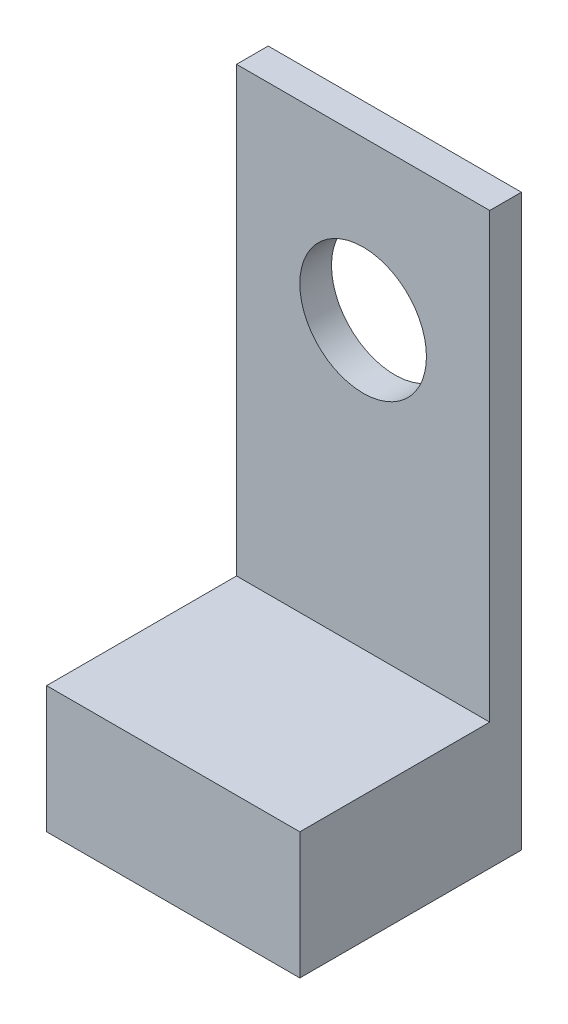
ISO-10303-21;
HEADER;
FILE_DESCRIPTION(('STEP AP214'),'2;1');
FILE_NAME('part.step','',(''),(''),'','','');
FILE_SCHEMA(('AUTOMOTIVE_DESIGN { 1 0 10303 214 1 1 1 1 }'));
ENDSEC;
DATA;
#1=APPLICATION_CONTEXT('core data for automotive mechanical design processes');
#2=APPLICATION_PROTOCOL_DEFINITION('international standard','automotive_design',2000,#1);
#3=PRODUCT_CONTEXT('',#1,'mechanical');
#4=PRODUCT('Part','Part','',(#3));
#5=PRODUCT_RELATED_PRODUCT_CATEGORY('part','',(#4));
#6=PRODUCT_DEFINITION_FORMATION('','',#4);
#7=PRODUCT_DEFINITION_CONTEXT('part definition',#1,'design');
#8=PRODUCT_DEFINITION('design','',#6,#7);
#9=PRODUCT_DEFINITION_SHAPE('','',#8);
#10=(LENGTH_UNIT() NAMED_UNIT(*) SI_UNIT(.MILLI.,.METRE.));
#11=(NAMED_UNIT(*) PLANE_ANGLE_UNIT() SI_UNIT($,.RADIAN.));
#12=(NAMED_UNIT(*) SI_UNIT($,.STERADIAN.) SOLID_ANGLE_UNIT());
#13=UNCERTAINTY_MEASURE_WITH_UNIT(LENGTH_MEASURE(1.E-05),#10,'distance_accuracy_value','');
#14=(GEOMETRIC_REPRESENTATION_CONTEXT(3) GLOBAL_UNCERTAINTY_ASSIGNED_CONTEXT((#13)) GLOBAL_UNIT_ASSIGNED_CONTEXT((#10,
#11,#12)) REPRESENTATION_CONTEXT('',''));
#15=CARTESIAN_POINT('',(0.,0.,0.));
#16=DIRECTION('',(0.,0.,1.));
#17=DIRECTION('',(1.,0.,0.));
#18=AXIS2_PLACEMENT_3D('',#15,#16,#17);
#19=CARTESIAN_POINT('',(19.8927253663827,59.603113743464,5.));
#20=DIRECTION('',(-1.,0.,0.));
#21=DIRECTION('',(0.,-1.,0.));
#22=AXIS2_PLACEMENT_3D('',#19,#20,#21);
#23=PLANE('',#22);
#24=DIRECTION('',(0.,1.,0.));
#25=VECTOR('',#24,1.);
#26=CARTESIAN_POINT('',(19.8927253663827,59.603113743464,0.));
#27=LINE('',#26,#25);
#28=CARTESIAN_POINT('',(19.8927253663827,-30.396886256536,0.));
#29=VERTEX_POINT('',#28);
#30=CARTESIAN_POINT('',(19.8927253663827,59.603113743464,0.));
#31=VERTEX_POINT('',#30);
#32=EDGE_CURVE('E95',#29,#31,#27,.T.);
#33=ORIENTED_EDGE('',*,*,#32,.T.);
#34=DIRECTION('',(0.,0.,-1.));
#35=VECTOR('',#34,1.);
#36=CARTESIAN_POINT('',(19.8927253663827,59.603113743464,5.));
#37=LINE('',#36,#35);
#38=CARTESIAN_POINT('',(19.8927253663827,59.603113743464,5.));
#39=VERTEX_POINT('',#38);
#40=EDGE_CURVE('E11',#39,#31,#37,.T.);
#41=ORIENTED_EDGE('',*,*,#40,.F.);
#42=DIRECTION('',(0.,1.,0.));
#43=VECTOR('',#42,1.);
#44=CARTESIAN_POINT('',(19.8927253663827,59.603113743464,5.));
#45=LINE('',#44,#43);
#46=CARTESIAN_POINT('',(19.8927253663827,-10.396886256536,5.));
#47=VERTEX_POINT('',#46);
#48=EDGE_CURVE('E88',#47,#39,#45,.T.);
#49=ORIENTED_EDGE('',*,*,#48,.F.);
#50=DIRECTION('',(0.,0.,-1.));
#51=VECTOR('',#50,1.);
#52=CARTESIAN_POINT('',(19.8927253663827,-10.396886256536,35.));
#53=LINE('',#52,#51);
#54=CARTESIAN_POINT('',(19.8927253663827,-10.396886256536,35.));
#55=VERTEX_POINT('',#54);
#56=EDGE_CURVE('E103',#55,#47,#53,.T.);
#57=ORIENTED_EDGE('',*,*,#56,.F.);
#58=DIRECTION('',(0.,1.,0.));
#59=VECTOR('',#58,1.);
#60=CARTESIAN_POINT('',(19.8927253663827,-30.396886256536,35.));
#61=LINE('',#60,#59);
#62=CARTESIAN_POINT('',(19.8927253663827,-30.396886256536,35.));
#63=VERTEX_POINT('',#62);
#64=EDGE_CURVE('E98',#63,#55,#61,.T.);
#65=ORIENTED_EDGE('',*,*,#64,.F.);
#66=DIRECTION('',(0.,0.,-1.));
#67=VECTOR('',#66,1.);
#68=CARTESIAN_POINT('',(19.8927253663827,-30.396886256536,5.));
#69=LINE('',#68,#67);
#70=EDGE_CURVE('E81',#63,#29,#69,.T.);
#71=ORIENTED_EDGE('',*,*,#70,.T.);
#72=EDGE_LOOP('',(#33,#41,#49,#57,#65,#71));
#73=FACE_BOUND('',#72,.T.);
#74=ADVANCED_FACE('F36',(#73),#23,.F.);
#75=CARTESIAN_POINT('',(-20.1072746336173,59.603113743464,5.));
#76=DIRECTION('',(0.,-1.,0.));
#77=DIRECTION('',(0.,0.,-1.));
#78=AXIS2_PLACEMENT_3D('',#75,#76,#77);
#79=PLANE('',#78);
#80=DIRECTION('',(-1.,0.,0.));
#81=VECTOR('',#80,1.);
#82=CARTESIAN_POINT('',(-20.1072746336173,59.603113743464,0.));
#83=LINE('',#82,#81);
#84=CARTESIAN_POINT('',(-20.1072746336173,59.603113743464,0.));
#85=VERTEX_POINT('',#84);
#86=EDGE_CURVE('E102',#31,#85,#83,.T.);
#87=ORIENTED_EDGE('',*,*,#86,.T.);
#88=DIRECTION('',(0.,0.,-1.));
#89=VECTOR('',#88,1.);
#90=CARTESIAN_POINT('',(-20.1072746336173,59.603113743464,5.));
#91=LINE('',#90,#89);
#92=CARTESIAN_POINT('',(-20.1072746336173,59.603113743464,5.));
#93=VERTEX_POINT('',#92);
#94=EDGE_CURVE('E43',#93,#85,#91,.T.);
#95=ORIENTED_EDGE('',*,*,#94,.F.);
#96=DIRECTION('',(-1.,0.,0.));
#97=VECTOR('',#96,1.);
#98=CARTESIAN_POINT('',(-20.1072746336173,59.603113743464,5.));
#99=LINE('',#98,#97);
#100=EDGE_CURVE('E56',#39,#93,#99,.T.);
#101=ORIENTED_EDGE('',*,*,#100,.F.);
#102=ORIENTED_EDGE('',*,*,#40,.T.);
#103=EDGE_LOOP('',(#87,#95,#101,#102));
#104=FACE_BOUND('',#103,.T.);
#105=ADVANCED_FACE('F119',(#104),#79,.F.);
#106=CARTESIAN_POINT('',(-20.1072746336173,59.603113743464,5.));
#107=DIRECTION('',(1.,0.,0.));
#108=DIRECTION('',(0.,1.,0.));
#109=AXIS2_PLACEMENT_3D('',#106,#107,#108);
#110=PLANE('',#109);
#111=DIRECTION('',(0.,-1.,0.));
#112=VECTOR('',#111,1.);
#113=CARTESIAN_POINT('',(-20.1072746336173,59.603113743464,0.));
#114=LINE('',#113,#112);
#115=CARTESIAN_POINT('',(-20.1072746336173,-30.396886256536,0.));
#116=VERTEX_POINT('',#115);
#117=EDGE_CURVE('E89',#85,#116,#114,.T.);
#118=ORIENTED_EDGE('',*,*,#117,.T.);
#119=DIRECTION('',(0.,0.,-1.));
#120=VECTOR('',#119,1.);
#121=CARTESIAN_POINT('',(-20.1072746336173,-30.396886256536,5.));
#122=LINE('',#121,#120);
#123=CARTESIAN_POINT('',(-20.1072746336173,-30.396886256536,35.));
#124=VERTEX_POINT('',#123);
#125=EDGE_CURVE('E84',#124,#116,#122,.T.);
#126=ORIENTED_EDGE('',*,*,#125,.F.);
#127=DIRECTION('',(0.,-1.,0.));
#128=VECTOR('',#127,1.);
#129=CARTESIAN_POINT('',(-20.1072746336173,-30.396886256536,35.));
#130=LINE('',#129,#128);
#131=CARTESIAN_POINT('',(-20.1072746336173,-10.396886256536,35.));
#132=VERTEX_POINT('',#131);
#133=EDGE_CURVE('E139',#132,#124,#130,.T.);
#134=ORIENTED_EDGE('',*,*,#133,.F.);
#135=DIRECTION('',(0.,0.,-1.));
#136=VECTOR('',#135,1.);
#137=CARTESIAN_POINT('',(-20.1072746336173,-10.396886256536,35.));
#138=LINE('',#137,#136);
#139=CARTESIAN_POINT('',(-20.1072746336173,-10.396886256536,5.));
#140=VERTEX_POINT('',#139);
#141=EDGE_CURVE('E107',#132,#140,#138,.T.);
#142=ORIENTED_EDGE('',*,*,#141,.T.);
#143=DIRECTION('',(0.,-1.,0.));
#144=VECTOR('',#143,1.);
#145=CARTESIAN_POINT('',(-20.1072746336173,59.603113743464,5.));
#146=LINE('',#145,#144);
#147=EDGE_CURVE('E99',#93,#140,#146,.T.);
#148=ORIENTED_EDGE('',*,*,#147,.F.);
#149=ORIENTED_EDGE('',*,*,#94,.T.);
#150=EDGE_LOOP('',(#118,#126,#134,#142,#148,#149));
#151=FACE_BOUND('',#150,.T.);
#152=ADVANCED_FACE('F116',(#151),#110,.F.);
#153=CARTESIAN_POINT('',(-20.1072746336173,-30.396886256536,5.));
#154=DIRECTION('',(0.,1.,0.));
#155=DIRECTION('',(0.,0.,1.));
#156=AXIS2_PLACEMENT_3D('',#153,#154,#155);
#157=PLANE('',#156);
#158=DIRECTION('',(1.,0.,0.));
#159=VECTOR('',#158,1.);
#160=CARTESIAN_POINT('',(-20.1072746336173,-30.396886256536,0.));
#161=LINE('',#160,#159);
#162=EDGE_CURVE('E76',#116,#29,#161,.T.);
#163=ORIENTED_EDGE('',*,*,#162,.T.);
#164=ORIENTED_EDGE('',*,*,#70,.F.);
#165=DIRECTION('',(1.,0.,0.));
#166=VECTOR('',#165,1.);
#167=CARTESIAN_POINT('',(-20.1072746336173,-30.396886256536,35.));
#168=LINE('',#167,#166);
#169=EDGE_CURVE('E135',#124,#63,#168,.T.);
#170=ORIENTED_EDGE('',*,*,#169,.F.);
#171=ORIENTED_EDGE('',*,*,#125,.T.);
#172=EDGE_LOOP('',(#163,#164,#170,#171));
#173=FACE_BOUND('',#172,.T.);
#174=ADVANCED_FACE('F78',(#173),#157,.F.);
#175=CARTESIAN_POINT('',(0.,0.,5.));
#176=DIRECTION('',(0.,0.,1.));
#177=DIRECTION('',(1.,0.,0.));
#178=AXIS2_PLACEMENT_3D('',#175,#176,#177);
#179=PLANE('',#178);
#180=CARTESIAN_POINT('',(-0.107274633617312,34.603113743464,5.));
#181=DIRECTION('',(0.,0.,1.));
#182=DIRECTION('',(1.,0.,0.));
#183=AXIS2_PLACEMENT_3D('',#180,#181,#182);
#184=CIRCLE('',#183,10.);
#185=CARTESIAN_POINT('',(9.8927253663827,34.603113743464,5.));
#186=VERTEX_POINT('',#185);
#187=EDGE_CURVE('E140',#186,#186,#184,.T.);
#188=ORIENTED_EDGE('',*,*,#187,.F.);
#189=EDGE_LOOP('',(#188));
#190=FACE_BOUND('',#189,.T.);
#191=DIRECTION('',(-1.,0.,0.));
#192=VECTOR('',#191,1.);
#193=CARTESIAN_POINT('',(-20.1072746336173,-10.396886256536,5.));
#194=LINE('',#193,#192);
#195=EDGE_CURVE('E50',#47,#140,#194,.T.);
#196=ORIENTED_EDGE('',*,*,#195,.F.);
#197=ORIENTED_EDGE('',*,*,#48,.T.);
#198=ORIENTED_EDGE('',*,*,#100,.T.);
#199=ORIENTED_EDGE('',*,*,#147,.T.);
#200=EDGE_LOOP('',(#196,#197,#198,#199));
#201=FACE_BOUND('',#200,.T.);
#202=ADVANCED_FACE('F141',(#190,#201),#179,.T.);
#203=CARTESIAN_POINT('',(0.,0.,0.));
#204=DIRECTION('',(0.,0.,1.));
#205=DIRECTION('',(1.,0.,0.));
#206=AXIS2_PLACEMENT_3D('',#203,#204,#205);
#207=PLANE('',#206);
#208=CARTESIAN_POINT('',(-0.107274633617312,34.603113743464,0.));
#209=DIRECTION('',(0.,0.,-1.));
#210=DIRECTION('',(-1.,0.,0.));
#211=AXIS2_PLACEMENT_3D('',#208,#209,#210);
#212=CIRCLE('',#211,10.);
#213=CARTESIAN_POINT('',(-10.1072746336173,34.603113743464,0.));
#214=VERTEX_POINT('',#213);
#215=EDGE_CURVE('E151',#214,#214,#212,.T.);
#216=ORIENTED_EDGE('',*,*,#215,.F.);
#217=EDGE_LOOP('',(#216));
#218=FACE_BOUND('',#217,.T.);
#219=ORIENTED_EDGE('',*,*,#32,.F.);
#220=ORIENTED_EDGE('',*,*,#162,.F.);
#221=ORIENTED_EDGE('',*,*,#117,.F.);
#222=ORIENTED_EDGE('',*,*,#86,.F.);
#223=EDGE_LOOP('',(#219,#220,#221,#222));
#224=FACE_BOUND('',#223,.T.);
#225=ADVANCED_FACE('F101',(#218,#224),#207,.F.);
#226=CARTESIAN_POINT('',(-20.1072746336173,-10.396886256536,35.));
#227=DIRECTION('',(0.,-1.,0.));
#228=DIRECTION('',(0.,0.,-1.));
#229=AXIS2_PLACEMENT_3D('',#226,#227,#228);
#230=PLANE('',#229);
#231=ORIENTED_EDGE('',*,*,#195,.T.);
#232=ORIENTED_EDGE('',*,*,#141,.F.);
#233=DIRECTION('',(-1.,0.,0.));
#234=VECTOR('',#233,1.);
#235=CARTESIAN_POINT('',(-20.1072746336173,-10.396886256536,35.));
#236=LINE('',#235,#234);
#237=EDGE_CURVE('E128',#55,#132,#236,.T.);
#238=ORIENTED_EDGE('',*,*,#237,.F.);
#239=ORIENTED_EDGE('',*,*,#56,.T.);
#240=EDGE_LOOP('',(#231,#232,#238,#239));
#241=FACE_BOUND('',#240,.T.);
#242=ADVANCED_FACE('F124',(#241),#230,.F.);
#243=CARTESIAN_POINT('',(0.,0.,35.));
#244=DIRECTION('',(0.,0.,-1.));
#245=DIRECTION('',(-1.,0.,0.));
#246=AXIS2_PLACEMENT_3D('',#243,#244,#245);
#247=PLANE('',#246);
#248=ORIENTED_EDGE('',*,*,#133,.T.);
#249=ORIENTED_EDGE('',*,*,#169,.T.);
#250=ORIENTED_EDGE('',*,*,#64,.T.);
#251=ORIENTED_EDGE('',*,*,#237,.T.);
#252=EDGE_LOOP('',(#248,#249,#250,#251));
#253=FACE_BOUND('',#252,.T.);
#254=ADVANCED_FACE('F146',(#253),#247,.F.);
#255=CARTESIAN_POINT('',(-0.107274633617312,34.603113743464,30.));
#256=DIRECTION('',(0.,0.,-1.));
#257=DIRECTION('',(-1.,0.,0.));
#258=AXIS2_PLACEMENT_3D('',#255,#256,#257);
#259=CYLINDRICAL_SURFACE('',#258,10.);
#260=ORIENTED_EDGE('',*,*,#187,.T.);
#261=EDGE_LOOP('',(#260));
#262=FACE_BOUND('',#261,.T.);
#263=ORIENTED_EDGE('',*,*,#215,.T.);
#264=EDGE_LOOP('',(#263));
#265=FACE_BOUND('',#264,.T.);
#266=ADVANCED_FACE('F155',(#262,#265),#259,.F.);
#267=CLOSED_SHELL('',(#74,#105,#152,#174,#202,#225,#242,#254,#266));
#268=MANIFOLD_SOLID_BREP('B2',#267);
#269=ADVANCED_BREP_SHAPE_REPRESENTATION('',(#18,#268),#14);
#270=SHAPE_DEFINITION_REPRESENTATION(#9,#269);
ENDSEC;
END-ISO-10303-21;
